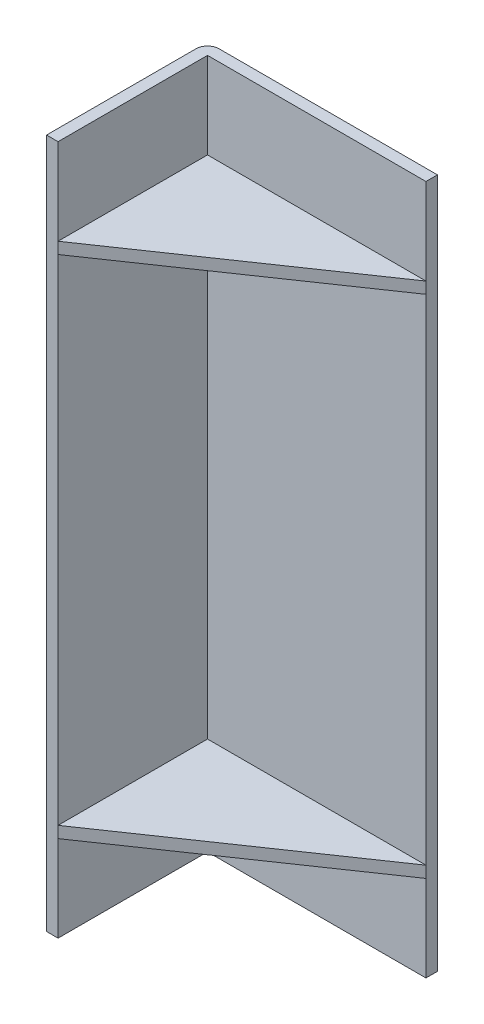
ISO-10303-21;
HEADER;
FILE_DESCRIPTION(('STEP AP214'),'2;1');
FILE_NAME('part.step','',(''),(''),'','','');
FILE_SCHEMA(('AUTOMOTIVE_DESIGN { 1 0 10303 214 1 1 1 1 }'));
ENDSEC;
DATA;
#1=APPLICATION_CONTEXT('core data for automotive mechanical design processes');
#2=APPLICATION_PROTOCOL_DEFINITION('international standard','automotive_design',2000,#1);
#3=PRODUCT_CONTEXT('',#1,'mechanical');
#4=PRODUCT('Part','Part','',(#3));
#5=PRODUCT_RELATED_PRODUCT_CATEGORY('part','',(#4));
#6=PRODUCT_DEFINITION_FORMATION('','',#4);
#7=PRODUCT_DEFINITION_CONTEXT('part definition',#1,'design');
#8=PRODUCT_DEFINITION('design','',#6,#7);
#9=PRODUCT_DEFINITION_SHAPE('','',#8);
#10=(LENGTH_UNIT() NAMED_UNIT(*) SI_UNIT(.MILLI.,.METRE.));
#11=(NAMED_UNIT(*) PLANE_ANGLE_UNIT() SI_UNIT($,.RADIAN.));
#12=(NAMED_UNIT(*) SI_UNIT($,.STERADIAN.) SOLID_ANGLE_UNIT());
#13=UNCERTAINTY_MEASURE_WITH_UNIT(LENGTH_MEASURE(1.E-05),#10,'distance_accuracy_value','');
#14=(GEOMETRIC_REPRESENTATION_CONTEXT(3) GLOBAL_UNCERTAINTY_ASSIGNED_CONTEXT((#13)) GLOBAL_UNIT_ASSIGNED_CONTEXT((#10,
#11,#12)) REPRESENTATION_CONTEXT('',''));
#15=CARTESIAN_POINT('',(0.,0.,0.));
#16=DIRECTION('',(0.,0.,1.));
#17=DIRECTION('',(1.,0.,0.));
#18=AXIS2_PLACEMENT_3D('',#15,#16,#17);
#19=CARTESIAN_POINT('',(5.,150.,5.00000000000004));
#20=DIRECTION('',(-1.,0.,0.));
#21=DIRECTION('',(0.,0.,1.));
#22=AXIS2_PLACEMENT_3D('',#19,#20,#21);
#23=PLANE('',#22);
#24=DIRECTION('',(0.,0.,1.));
#25=VECTOR('',#24,1.);
#26=CARTESIAN_POINT('',(5.,-107.5,5.00000000000004));
#27=LINE('',#26,#25);
#28=CARTESIAN_POINT('',(5.,-107.5,5.00000000000004));
#29=VERTEX_POINT('',#28);
#30=CARTESIAN_POINT('',(5.,-107.5,70.));
#31=VERTEX_POINT('',#30);
#32=EDGE_CURVE('E58',#29,#31,#27,.T.);
#33=ORIENTED_EDGE('',*,*,#32,.F.);
#34=DIRECTION('',(0.,-1.,0.));
#35=VECTOR('',#34,1.);
#36=CARTESIAN_POINT('',(5.,150.,5.00000000000004));
#37=LINE('',#36,#35);
#38=CARTESIAN_POINT('',(5.,107.5,5.00000000000004));
#39=VERTEX_POINT('',#38);
#40=EDGE_CURVE('E223',#39,#29,#37,.T.);
#41=ORIENTED_EDGE('',*,*,#40,.F.);
#42=DIRECTION('',(0.,0.,-1.));
#43=VECTOR('',#42,1.);
#44=CARTESIAN_POINT('',(5.,107.5,5.00000000000004));
#45=LINE('',#44,#43);
#46=CARTESIAN_POINT('',(5.,107.5,70.));
#47=VERTEX_POINT('',#46);
#48=EDGE_CURVE('E175',#47,#39,#45,.T.);
#49=ORIENTED_EDGE('',*,*,#48,.F.);
#50=DIRECTION('',(0.,-1.,0.));
#51=VECTOR('',#50,1.);
#52=CARTESIAN_POINT('',(5.,150.,70.));
#53=LINE('',#52,#51);
#54=EDGE_CURVE('E160',#47,#31,#53,.T.);
#55=ORIENTED_EDGE('',*,*,#54,.T.);
#56=EDGE_LOOP('',(#33,#41,#49,#55));
#57=FACE_BOUND('',#56,.T.);
#58=ADVANCED_FACE('F35',(#57),#23,.F.);
#59=CARTESIAN_POINT('',(5.,150.,5.00000000000004));
#60=DIRECTION('',(0.,0.,-1.));
#61=DIRECTION('',(-1.,0.,0.));
#62=AXIS2_PLACEMENT_3D('',#59,#60,#61);
#63=PLANE('',#62);
#64=DIRECTION('',(-1.,0.,0.));
#65=VECTOR('',#64,1.);
#66=CARTESIAN_POINT('',(5.,-107.5,5.00000000000004));
#67=LINE('',#66,#65);
#68=CARTESIAN_POINT('',(100.,-107.5,5.));
#69=VERTEX_POINT('',#68);
#70=EDGE_CURVE('E162',#69,#29,#67,.T.);
#71=ORIENTED_EDGE('',*,*,#70,.F.);
#72=DIRECTION('',(0.,-1.,0.));
#73=VECTOR('',#72,1.);
#74=CARTESIAN_POINT('',(100.,150.,5.));
#75=LINE('',#74,#73);
#76=CARTESIAN_POINT('',(100.,107.5,5.));
#77=VERTEX_POINT('',#76);
#78=EDGE_CURVE('E318',#77,#69,#75,.T.);
#79=ORIENTED_EDGE('',*,*,#78,.F.);
#80=DIRECTION('',(1.,0.,0.));
#81=VECTOR('',#80,1.);
#82=CARTESIAN_POINT('',(5.,107.5,5.00000000000004));
#83=LINE('',#82,#81);
#84=EDGE_CURVE('E43',#39,#77,#83,.T.);
#85=ORIENTED_EDGE('',*,*,#84,.F.);
#86=ORIENTED_EDGE('',*,*,#40,.T.);
#87=EDGE_LOOP('',(#71,#79,#85,#86));
#88=FACE_BOUND('',#87,.T.);
#89=ADVANCED_FACE('F279',(#88),#63,.F.);
#90=CARTESIAN_POINT('',(5.,-112.5,5.00000000000004));
#91=VERTEX_POINT('',#90);
#92=CARTESIAN_POINT('',(5.,-150.,5.00000000000004));
#93=VERTEX_POINT('',#92);
#94=EDGE_CURVE('E147',#91,#93,#37,.T.);
#95=ORIENTED_EDGE('',*,*,#94,.F.);
#96=DIRECTION('',(0.,0.,1.));
#97=VECTOR('',#96,1.);
#98=CARTESIAN_POINT('',(5.,-112.5,5.00000000000004));
#99=LINE('',#98,#97);
#100=CARTESIAN_POINT('',(5.,-112.5,70.));
#101=VERTEX_POINT('',#100);
#102=EDGE_CURVE('E145',#91,#101,#99,.T.);
#103=ORIENTED_EDGE('',*,*,#102,.T.);
#104=CARTESIAN_POINT('',(5.,-150.,70.));
#105=VERTEX_POINT('',#104);
#106=EDGE_CURVE('E130',#101,#105,#53,.T.);
#107=ORIENTED_EDGE('',*,*,#106,.T.);
#108=DIRECTION('',(0.,0.,-1.));
#109=VECTOR('',#108,1.);
#110=CARTESIAN_POINT('',(5.,-150.,5.00000000000004));
#111=LINE('',#110,#109);
#112=EDGE_CURVE('E214',#105,#93,#111,.T.);
#113=ORIENTED_EDGE('',*,*,#112,.T.);
#114=EDGE_LOOP('',(#95,#103,#107,#113));
#115=FACE_BOUND('',#114,.T.);
#116=ADVANCED_FACE('F146',(#115),#23,.F.);
#117=CARTESIAN_POINT('',(100.,-112.5,5.));
#118=VERTEX_POINT('',#117);
#119=CARTESIAN_POINT('',(100.,-150.,5.));
#120=VERTEX_POINT('',#119);
#121=EDGE_CURVE('E201',#118,#120,#75,.T.);
#122=ORIENTED_EDGE('',*,*,#121,.F.);
#123=DIRECTION('',(-1.,0.,0.));
#124=VECTOR('',#123,1.);
#125=CARTESIAN_POINT('',(5.,-112.5,5.00000000000004));
#126=LINE('',#125,#124);
#127=EDGE_CURVE('E50',#118,#91,#126,.T.);
#128=ORIENTED_EDGE('',*,*,#127,.T.);
#129=ORIENTED_EDGE('',*,*,#94,.T.);
#130=DIRECTION('',(1.,0.,0.));
#131=VECTOR('',#130,1.);
#132=CARTESIAN_POINT('',(5.,-150.,5.00000000000004));
#133=LINE('',#132,#131);
#134=EDGE_CURVE('E189',#93,#120,#133,.T.);
#135=ORIENTED_EDGE('',*,*,#134,.T.);
#136=EDGE_LOOP('',(#122,#128,#129,#135));
#137=FACE_BOUND('',#136,.T.);
#138=ADVANCED_FACE('F277',(#137),#63,.F.);
#139=CARTESIAN_POINT('',(100.,150.,0.));
#140=DIRECTION('',(-1.,0.,0.));
#141=DIRECTION('',(0.,0.,1.));
#142=AXIS2_PLACEMENT_3D('',#139,#140,#141);
#143=PLANE('',#142);
#144=DIRECTION('',(0.,0.,-1.));
#145=VECTOR('',#144,1.);
#146=CARTESIAN_POINT('',(100.,-150.,0.));
#147=LINE('',#146,#145);
#148=CARTESIAN_POINT('',(100.,-150.,0.));
#149=VERTEX_POINT('',#148);
#150=EDGE_CURVE('E184',#120,#149,#147,.T.);
#151=ORIENTED_EDGE('',*,*,#150,.T.);
#152=DIRECTION('',(0.,-1.,0.));
#153=VECTOR('',#152,1.);
#154=CARTESIAN_POINT('',(100.,150.,0.));
#155=LINE('',#154,#153);
#156=CARTESIAN_POINT('',(100.,150.,0.));
#157=VERTEX_POINT('',#156);
#158=EDGE_CURVE('E232',#157,#149,#155,.T.);
#159=ORIENTED_EDGE('',*,*,#158,.F.);
#160=DIRECTION('',(0.,0.,-1.));
#161=VECTOR('',#160,1.);
#162=CARTESIAN_POINT('',(100.,150.,0.));
#163=LINE('',#162,#161);
#164=CARTESIAN_POINT('',(100.,150.,5.));
#165=VERTEX_POINT('',#164);
#166=EDGE_CURVE('E185',#165,#157,#163,.T.);
#167=ORIENTED_EDGE('',*,*,#166,.F.);
#168=CARTESIAN_POINT('',(100.,112.5,5.));
#169=VERTEX_POINT('',#168);
#170=EDGE_CURVE('E218',#165,#169,#75,.T.);
#171=ORIENTED_EDGE('',*,*,#170,.T.);
#172=EDGE_CURVE('E221',#169,#77,#75,.T.);
#173=ORIENTED_EDGE('',*,*,#172,.T.);
#174=ORIENTED_EDGE('',*,*,#78,.T.);
#175=DIRECTION('',(0.,1.,0.));
#176=VECTOR('',#175,1.);
#177=CARTESIAN_POINT('',(100.,150.,5.));
#178=LINE('',#177,#176);
#179=EDGE_CURVE('E150',#118,#69,#178,.T.);
#180=ORIENTED_EDGE('',*,*,#179,.F.);
#181=ORIENTED_EDGE('',*,*,#121,.T.);
#182=EDGE_LOOP('',(#151,#159,#167,#171,#173,#174,#180,#181));
#183=FACE_BOUND('',#182,.T.);
#184=ADVANCED_FACE('F37',(#183),#143,.F.);
#185=CARTESIAN_POINT('',(5.00000000000004,150.,0.));
#186=DIRECTION('',(0.,0.,1.));
#187=DIRECTION('',(1.,0.,0.));
#188=AXIS2_PLACEMENT_3D('',#185,#186,#187);
#189=PLANE('',#188);
#190=DIRECTION('',(-1.,0.,0.));
#191=VECTOR('',#190,1.);
#192=CARTESIAN_POINT('',(5.00000000000004,-150.,0.));
#193=LINE('',#192,#191);
#194=CARTESIAN_POINT('',(5.00000000000004,-150.,0.));
#195=VERTEX_POINT('',#194);
#196=EDGE_CURVE('E204',#149,#195,#193,.T.);
#197=ORIENTED_EDGE('',*,*,#196,.T.);
#198=DIRECTION('',(0.,-1.,0.));
#199=VECTOR('',#198,1.);
#200=CARTESIAN_POINT('',(5.00000000000004,150.,0.));
#201=LINE('',#200,#199);
#202=CARTESIAN_POINT('',(5.00000000000004,150.,0.));
#203=VERTEX_POINT('',#202);
#204=EDGE_CURVE('E230',#203,#195,#201,.T.);
#205=ORIENTED_EDGE('',*,*,#204,.F.);
#206=DIRECTION('',(-1.,0.,0.));
#207=VECTOR('',#206,1.);
#208=CARTESIAN_POINT('',(5.00000000000004,150.,0.));
#209=LINE('',#208,#207);
#210=EDGE_CURVE('E188',#157,#203,#209,.T.);
#211=ORIENTED_EDGE('',*,*,#210,.F.);
#212=ORIENTED_EDGE('',*,*,#158,.T.);
#213=EDGE_LOOP('',(#197,#205,#211,#212));
#214=FACE_BOUND('',#213,.T.);
#215=ADVANCED_FACE('F310',(#214),#189,.F.);
#216=CARTESIAN_POINT('',(5.,150.,5.));
#217=DIRECTION('',(0.,-1.,0.));
#218=DIRECTION('',(0.,0.,-1.));
#219=AXIS2_PLACEMENT_3D('',#216,#217,#218);
#220=CYLINDRICAL_SURFACE('',#219,5.);
#221=CARTESIAN_POINT('',(5.,-150.,5.));
#222=DIRECTION('',(0.,1.,0.));
#223=DIRECTION('',(0.,0.,1.));
#224=AXIS2_PLACEMENT_3D('',#221,#222,#223);
#225=CIRCLE('',#224,5.);
#226=CARTESIAN_POINT('',(0.,-150.,5.00000000000003));
#227=VERTEX_POINT('',#226);
#228=EDGE_CURVE('E207',#195,#227,#225,.T.);
#229=ORIENTED_EDGE('',*,*,#228,.T.);
#230=DIRECTION('',(0.,-1.,0.));
#231=VECTOR('',#230,1.);
#232=CARTESIAN_POINT('',(0.,150.,5.00000000000003));
#233=LINE('',#232,#231);
#234=CARTESIAN_POINT('',(0.,150.,5.00000000000003));
#235=VERTEX_POINT('',#234);
#236=EDGE_CURVE('E228',#235,#227,#233,.T.);
#237=ORIENTED_EDGE('',*,*,#236,.F.);
#238=CARTESIAN_POINT('',(5.,150.,5.));
#239=DIRECTION('',(0.,1.,0.));
#240=DIRECTION('',(0.,0.,1.));
#241=AXIS2_PLACEMENT_3D('',#238,#239,#240);
#242=CIRCLE('',#241,5.);
#243=EDGE_CURVE('E191',#203,#235,#242,.T.);
#244=ORIENTED_EDGE('',*,*,#243,.F.);
#245=ORIENTED_EDGE('',*,*,#204,.T.);
#246=EDGE_LOOP('',(#229,#237,#244,#245));
#247=FACE_BOUND('',#246,.T.);
#248=ADVANCED_FACE('F306',(#247),#220,.T.);
#249=CARTESIAN_POINT('',(0.,150.,5.00000000000004));
#250=DIRECTION('',(1.,0.,0.));
#251=DIRECTION('',(0.,0.,-1.));
#252=AXIS2_PLACEMENT_3D('',#249,#250,#251);
#253=PLANE('',#252);
#254=DIRECTION('',(0.,0.,1.));
#255=VECTOR('',#254,1.);
#256=CARTESIAN_POINT('',(0.,-150.,5.00000000000004));
#257=LINE('',#256,#255);
#258=CARTESIAN_POINT('',(0.,-150.,70.));
#259=VERTEX_POINT('',#258);
#260=EDGE_CURVE('E210',#227,#259,#257,.T.);
#261=ORIENTED_EDGE('',*,*,#260,.T.);
#262=DIRECTION('',(0.,-1.,0.));
#263=VECTOR('',#262,1.);
#264=CARTESIAN_POINT('',(0.,150.,70.));
#265=LINE('',#264,#263);
#266=CARTESIAN_POINT('',(0.,150.,70.));
#267=VERTEX_POINT('',#266);
#268=EDGE_CURVE('E226',#267,#259,#265,.T.);
#269=ORIENTED_EDGE('',*,*,#268,.F.);
#270=DIRECTION('',(0.,0.,1.));
#271=VECTOR('',#270,1.);
#272=CARTESIAN_POINT('',(0.,150.,5.00000000000004));
#273=LINE('',#272,#271);
#274=EDGE_CURVE('E193',#235,#267,#273,.T.);
#275=ORIENTED_EDGE('',*,*,#274,.F.);
#276=ORIENTED_EDGE('',*,*,#236,.T.);
#277=EDGE_LOOP('',(#261,#269,#275,#276));
#278=FACE_BOUND('',#277,.T.);
#279=ADVANCED_FACE('F269',(#278),#253,.F.);
#280=CARTESIAN_POINT('',(0.,150.,70.));
#281=DIRECTION('',(0.,0.,-1.));
#282=DIRECTION('',(-1.,0.,0.));
#283=AXIS2_PLACEMENT_3D('',#280,#281,#282);
#284=PLANE('',#283);
#285=ORIENTED_EDGE('',*,*,#106,.F.);
#286=EDGE_CURVE('E135',#31,#101,#53,.T.);
#287=ORIENTED_EDGE('',*,*,#286,.F.);
#288=ORIENTED_EDGE('',*,*,#54,.F.);
#289=DIRECTION('',(0.,-1.,0.));
#290=VECTOR('',#289,1.);
#291=CARTESIAN_POINT('',(5.,150.,70.));
#292=LINE('',#291,#290);
#293=CARTESIAN_POINT('',(5.,112.5,70.));
#294=VERTEX_POINT('',#293);
#295=EDGE_CURVE('E182',#47,#294,#292,.F.);
#296=ORIENTED_EDGE('',*,*,#295,.T.);
#297=CARTESIAN_POINT('',(5.,150.,70.));
#298=VERTEX_POINT('',#297);
#299=EDGE_CURVE('E143',#298,#294,#53,.T.);
#300=ORIENTED_EDGE('',*,*,#299,.F.);
#301=DIRECTION('',(1.,0.,0.));
#302=VECTOR('',#301,1.);
#303=CARTESIAN_POINT('',(0.,150.,70.));
#304=LINE('',#303,#302);
#305=EDGE_CURVE('E195',#267,#298,#304,.T.);
#306=ORIENTED_EDGE('',*,*,#305,.F.);
#307=ORIENTED_EDGE('',*,*,#268,.T.);
#308=DIRECTION('',(1.,0.,0.));
#309=VECTOR('',#308,1.);
#310=CARTESIAN_POINT('',(0.,-150.,70.));
#311=LINE('',#310,#309);
#312=EDGE_CURVE('E137',#259,#105,#311,.T.);
#313=ORIENTED_EDGE('',*,*,#312,.T.);
#314=EDGE_LOOP('',(#285,#287,#288,#296,#300,#306,#307,#313));
#315=FACE_BOUND('',#314,.T.);
#316=ADVANCED_FACE('F132',(#315),#284,.F.);
#317=ORIENTED_EDGE('',*,*,#299,.T.);
#318=DIRECTION('',(0.,0.,-1.));
#319=VECTOR('',#318,1.);
#320=CARTESIAN_POINT('',(5.,112.5,5.00000000000004));
#321=LINE('',#320,#319);
#322=CARTESIAN_POINT('',(5.,112.5,5.00000000000004));
#323=VERTEX_POINT('',#322);
#324=EDGE_CURVE('E180',#294,#323,#321,.T.);
#325=ORIENTED_EDGE('',*,*,#324,.T.);
#326=CARTESIAN_POINT('',(5.,150.,5.00000000000004));
#327=VERTEX_POINT('',#326);
#328=EDGE_CURVE('E141',#327,#323,#37,.T.);
#329=ORIENTED_EDGE('',*,*,#328,.F.);
#330=DIRECTION('',(0.,0.,-1.));
#331=VECTOR('',#330,1.);
#332=CARTESIAN_POINT('',(5.,150.,5.00000000000004));
#333=LINE('',#332,#331);
#334=EDGE_CURVE('E197',#298,#327,#333,.T.);
#335=ORIENTED_EDGE('',*,*,#334,.F.);
#336=EDGE_LOOP('',(#317,#325,#329,#335));
#337=FACE_BOUND('',#336,.T.);
#338=ADVANCED_FACE('F249',(#337),#23,.F.);
#339=ORIENTED_EDGE('',*,*,#328,.T.);
#340=DIRECTION('',(1.,0.,0.));
#341=VECTOR('',#340,1.);
#342=CARTESIAN_POINT('',(5.,112.5,5.00000000000004));
#343=LINE('',#342,#341);
#344=EDGE_CURVE('E11',#323,#169,#343,.T.);
#345=ORIENTED_EDGE('',*,*,#344,.T.);
#346=ORIENTED_EDGE('',*,*,#170,.F.);
#347=DIRECTION('',(1.,0.,0.));
#348=VECTOR('',#347,1.);
#349=CARTESIAN_POINT('',(5.,150.,5.00000000000004));
#350=LINE('',#349,#348);
#351=EDGE_CURVE('E199',#327,#165,#350,.T.);
#352=ORIENTED_EDGE('',*,*,#351,.F.);
#353=EDGE_LOOP('',(#339,#345,#346,#352));
#354=FACE_BOUND('',#353,.T.);
#355=ADVANCED_FACE('F256',(#354),#63,.F.);
#356=CARTESIAN_POINT('',(5.,150.,5.));
#357=DIRECTION('',(0.,1.,0.));
#358=DIRECTION('',(0.,0.,1.));
#359=AXIS2_PLACEMENT_3D('',#356,#357,#358);
#360=PLANE('',#359);
#361=ORIENTED_EDGE('',*,*,#166,.T.);
#362=ORIENTED_EDGE('',*,*,#210,.T.);
#363=ORIENTED_EDGE('',*,*,#243,.T.);
#364=ORIENTED_EDGE('',*,*,#274,.T.);
#365=ORIENTED_EDGE('',*,*,#305,.T.);
#366=ORIENTED_EDGE('',*,*,#334,.T.);
#367=ORIENTED_EDGE('',*,*,#351,.T.);
#368=EDGE_LOOP('',(#361,#362,#363,#364,#365,#366,#367));
#369=FACE_BOUND('',#368,.T.);
#370=ADVANCED_FACE('F263',(#369),#360,.T.);
#371=CARTESIAN_POINT('',(5.,-150.,5.));
#372=DIRECTION('',(0.,1.,0.));
#373=DIRECTION('',(0.,0.,1.));
#374=AXIS2_PLACEMENT_3D('',#371,#372,#373);
#375=PLANE('',#374);
#376=ORIENTED_EDGE('',*,*,#150,.F.);
#377=ORIENTED_EDGE('',*,*,#134,.F.);
#378=ORIENTED_EDGE('',*,*,#112,.F.);
#379=ORIENTED_EDGE('',*,*,#312,.F.);
#380=ORIENTED_EDGE('',*,*,#260,.F.);
#381=ORIENTED_EDGE('',*,*,#228,.F.);
#382=ORIENTED_EDGE('',*,*,#196,.F.);
#383=EDGE_LOOP('',(#376,#377,#378,#379,#380,#381,#382));
#384=FACE_BOUND('',#383,.T.);
#385=ADVANCED_FACE('F274',(#384),#375,.F.);
#386=CARTESIAN_POINT('',(100.,110.,5.));
#387=DIRECTION('',(-0.56468391559199,0.,-0.825307261249832));
#388=DIRECTION('',(-0.825307261249832,0.,0.56468391559199));
#389=AXIS2_PLACEMENT_3D('',#386,#387,#388);
#390=PLANE('',#389);
#391=ORIENTED_EDGE('',*,*,#295,.F.);
#392=DIRECTION('',(-0.825307261249832,0.,0.56468391559199));
#393=VECTOR('',#392,1.);
#394=CARTESIAN_POINT('',(100.,107.5,5.));
#395=LINE('',#394,#393);
#396=EDGE_CURVE('E171',#77,#47,#395,.T.);
#397=ORIENTED_EDGE('',*,*,#396,.F.);
#398=ORIENTED_EDGE('',*,*,#172,.F.);
#399=DIRECTION('',(-0.825307261249832,0.,0.56468391559199));
#400=VECTOR('',#399,1.);
#401=CARTESIAN_POINT('',(100.,112.5,5.));
#402=LINE('',#401,#400);
#403=EDGE_CURVE('E172',#169,#294,#402,.T.);
#404=ORIENTED_EDGE('',*,*,#403,.T.);
#405=EDGE_LOOP('',(#391,#397,#398,#404));
#406=FACE_BOUND('',#405,.T.);
#407=ADVANCED_FACE('F242',(#406),#390,.F.);
#408=CARTESIAN_POINT('',(50.,112.5,35.));
#409=DIRECTION('',(0.,1.,0.));
#410=DIRECTION('',(0.,0.,1.));
#411=AXIS2_PLACEMENT_3D('',#408,#409,#410);
#412=PLANE('',#411);
#413=ORIENTED_EDGE('',*,*,#324,.F.);
#414=ORIENTED_EDGE('',*,*,#403,.F.);
#415=ORIENTED_EDGE('',*,*,#344,.F.);
#416=EDGE_LOOP('',(#413,#414,#415));
#417=FACE_BOUND('',#416,.T.);
#418=ADVANCED_FACE('F253',(#417),#412,.T.);
#419=CARTESIAN_POINT('',(50.,107.5,35.));
#420=DIRECTION('',(0.,1.,0.));
#421=DIRECTION('',(0.,0.,1.));
#422=AXIS2_PLACEMENT_3D('',#419,#420,#421);
#423=PLANE('',#422);
#424=ORIENTED_EDGE('',*,*,#396,.T.);
#425=ORIENTED_EDGE('',*,*,#48,.T.);
#426=ORIENTED_EDGE('',*,*,#84,.T.);
#427=EDGE_LOOP('',(#424,#425,#426));
#428=FACE_BOUND('',#427,.T.);
#429=ADVANCED_FACE('F236',(#428),#423,.F.);
#430=CARTESIAN_POINT('',(50.,-112.5,35.));
#431=DIRECTION('',(0.,-1.,0.));
#432=DIRECTION('',(0.,0.,-1.));
#433=AXIS2_PLACEMENT_3D('',#430,#431,#432);
#434=PLANE('',#433);
#435=ORIENTED_EDGE('',*,*,#102,.F.);
#436=ORIENTED_EDGE('',*,*,#127,.F.);
#437=DIRECTION('',(-0.825307261249832,0.,0.56468391559199));
#438=VECTOR('',#437,1.);
#439=CARTESIAN_POINT('',(100.,-112.5,5.));
#440=LINE('',#439,#438);
#441=EDGE_CURVE('E157',#118,#101,#440,.T.);
#442=ORIENTED_EDGE('',*,*,#441,.T.);
#443=EDGE_LOOP('',(#435,#436,#442));
#444=FACE_BOUND('',#443,.T.);
#445=ADVANCED_FACE('F161',(#444),#434,.T.);
#446=CARTESIAN_POINT('',(50.,-107.5,35.));
#447=DIRECTION('',(0.,-1.,0.));
#448=DIRECTION('',(0.,0.,-1.));
#449=AXIS2_PLACEMENT_3D('',#446,#447,#448);
#450=PLANE('',#449);
#451=ORIENTED_EDGE('',*,*,#70,.T.);
#452=ORIENTED_EDGE('',*,*,#32,.T.);
#453=DIRECTION('',(-0.825307261249832,0.,0.56468391559199));
#454=VECTOR('',#453,1.);
#455=CARTESIAN_POINT('',(100.,-107.5,5.));
#456=LINE('',#455,#454);
#457=EDGE_CURVE('E159',#69,#31,#456,.T.);
#458=ORIENTED_EDGE('',*,*,#457,.F.);
#459=EDGE_LOOP('',(#451,#452,#458));
#460=FACE_BOUND('',#459,.T.);
#461=ADVANCED_FACE('F281',(#460),#450,.F.);
#462=CARTESIAN_POINT('',(100.,-110.,5.));
#463=DIRECTION('',(0.56468391559199,0.,0.825307261249832));
#464=DIRECTION('',(-0.825307261249832,0.,0.56468391559199));
#465=AXIS2_PLACEMENT_3D('',#462,#463,#464);
#466=PLANE('',#465);
#467=ORIENTED_EDGE('',*,*,#441,.F.);
#468=ORIENTED_EDGE('',*,*,#179,.T.);
#469=ORIENTED_EDGE('',*,*,#457,.T.);
#470=ORIENTED_EDGE('',*,*,#286,.T.);
#471=EDGE_LOOP('',(#467,#468,#469,#470));
#472=FACE_BOUND('',#471,.T.);
#473=ADVANCED_FACE('F155',(#472),#466,.T.);
#474=CLOSED_SHELL('',(#58,#89,#116,#138,#184,#215,#248,#279,#316,#338,#355,#370,#385,#407,#418,
#429,#445,#461,#473));
#475=MANIFOLD_SOLID_BREP('B2',#474);
#476=ADVANCED_BREP_SHAPE_REPRESENTATION('',(#18,#475),#14);
#477=SHAPE_DEFINITION_REPRESENTATION(#9,#476);
ENDSEC;
END-ISO-10303-21;
